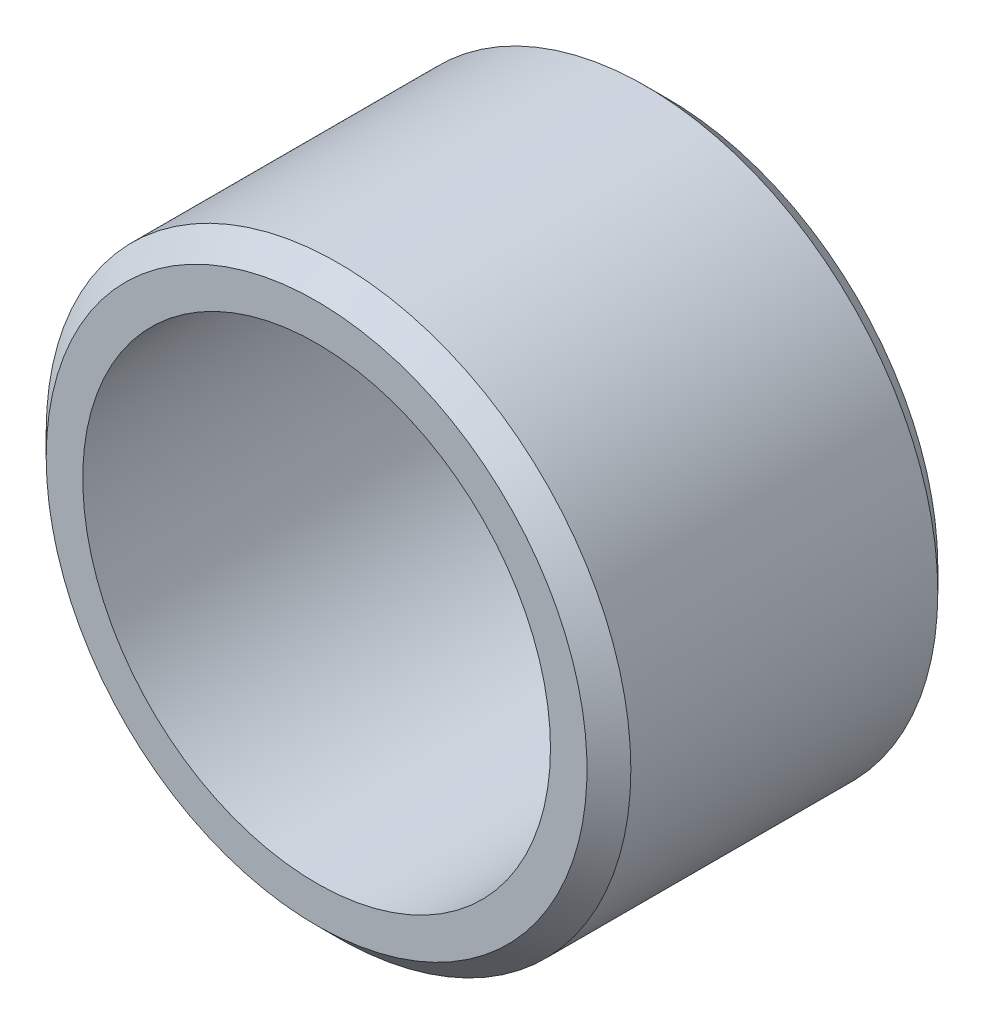
ISO-10303-21;
HEADER;
FILE_DESCRIPTION(('STEP AP214'),'2;1');
FILE_NAME('part.step','',(''),(''),'','','');
FILE_SCHEMA(('AUTOMOTIVE_DESIGN { 1 0 10303 214 1 1 1 1 }'));
ENDSEC;
DATA;
#1=APPLICATION_CONTEXT('core data for automotive mechanical design processes');
#2=APPLICATION_PROTOCOL_DEFINITION('international standard','automotive_design',2000,#1);
#3=PRODUCT_CONTEXT('',#1,'mechanical');
#4=PRODUCT('Part','Part','',(#3));
#5=PRODUCT_RELATED_PRODUCT_CATEGORY('part','',(#4));
#6=PRODUCT_DEFINITION_FORMATION('','',#4);
#7=PRODUCT_DEFINITION_CONTEXT('part definition',#1,'design');
#8=PRODUCT_DEFINITION('design','',#6,#7);
#9=PRODUCT_DEFINITION_SHAPE('','',#8);
#10=(LENGTH_UNIT() NAMED_UNIT(*) SI_UNIT(.MILLI.,.METRE.));
#11=(NAMED_UNIT(*) PLANE_ANGLE_UNIT() SI_UNIT($,.RADIAN.));
#12=(NAMED_UNIT(*) SI_UNIT($,.STERADIAN.) SOLID_ANGLE_UNIT());
#13=UNCERTAINTY_MEASURE_WITH_UNIT(LENGTH_MEASURE(1.E-05),#10,'distance_accuracy_value','');
#14=(GEOMETRIC_REPRESENTATION_CONTEXT(3) GLOBAL_UNCERTAINTY_ASSIGNED_CONTEXT((#13)) GLOBAL_UNIT_ASSIGNED_CONTEXT((#10,
#11,#12)) REPRESENTATION_CONTEXT('',''));
#15=CARTESIAN_POINT('',(0.,0.,0.));
#16=DIRECTION('',(0.,0.,1.));
#17=DIRECTION('',(1.,0.,0.));
#18=AXIS2_PLACEMENT_3D('',#15,#16,#17);
#19=CARTESIAN_POINT('',(0.,7.9375,4.7625));
#20=DIRECTION('',(0.,0.,-1.));
#21=DIRECTION('',(-1.,0.,0.));
#22=AXIS2_PLACEMENT_3D('',#19,#20,#21);
#23=PLANE('',#22);
#24=CARTESIAN_POINT('',(0.,0.,4.7625));
#25=DIRECTION('',(0.,0.,-1.));
#26=DIRECTION('',(-1.,0.,0.));
#27=AXIS2_PLACEMENT_3D('',#24,#25,#26);
#28=CIRCLE('',#27,7.3421875);
#29=CARTESIAN_POINT('',(-7.3421875,0.,4.7625));
#30=VERTEX_POINT('',#29);
#31=EDGE_CURVE('E10',#30,#30,#28,.F.);
#32=ORIENTED_EDGE('',*,*,#31,.T.);
#33=EDGE_LOOP('',(#32));
#34=FACE_BOUND('',#33,.T.);
#35=CARTESIAN_POINT('',(0.,0.,4.7625));
#36=DIRECTION('',(0.,0.,1.));
#37=DIRECTION('',(1.,0.,0.));
#38=AXIS2_PLACEMENT_3D('',#35,#36,#37);
#39=CIRCLE('',#38,6.35);
#40=CARTESIAN_POINT('',(6.35,0.,4.7625));
#41=VERTEX_POINT('',#40);
#42=EDGE_CURVE('E55',#41,#41,#39,.T.);
#43=ORIENTED_EDGE('',*,*,#42,.F.);
#44=EDGE_LOOP('',(#43));
#45=FACE_BOUND('',#44,.T.);
#46=ADVANCED_FACE('F35',(#34,#45),#23,.F.);
#47=CARTESIAN_POINT('',(0.,0.,4.7625));
#48=DIRECTION('',(0.,0.,1.));
#49=DIRECTION('',(1.,0.,0.));
#50=AXIS2_PLACEMENT_3D('',#47,#48,#49);
#51=CYLINDRICAL_SURFACE('',#50,6.35);
#52=CARTESIAN_POINT('',(0.,0.,-4.7625));
#53=DIRECTION('',(0.,0.,1.));
#54=DIRECTION('',(1.,0.,0.));
#55=AXIS2_PLACEMENT_3D('',#52,#53,#54);
#56=CIRCLE('',#55,6.35);
#57=CARTESIAN_POINT('',(6.35,0.,-4.7625));
#58=VERTEX_POINT('',#57);
#59=EDGE_CURVE('E58',#58,#58,#56,.T.);
#60=ORIENTED_EDGE('',*,*,#59,.F.);
#61=EDGE_LOOP('',(#60));
#62=FACE_BOUND('',#61,.T.);
#63=ORIENTED_EDGE('',*,*,#42,.T.);
#64=EDGE_LOOP('',(#63));
#65=FACE_BOUND('',#64,.T.);
#66=ADVANCED_FACE('F64',(#62,#65),#51,.F.);
#67=CARTESIAN_POINT('',(0.,6.35,-4.7625));
#68=DIRECTION('',(0.,0.,1.));
#69=DIRECTION('',(1.,0.,0.));
#70=AXIS2_PLACEMENT_3D('',#67,#68,#69);
#71=PLANE('',#70);
#72=CARTESIAN_POINT('',(0.,0.,-4.7625));
#73=DIRECTION('',(0.,0.,1.));
#74=DIRECTION('',(1.,0.,0.));
#75=AXIS2_PLACEMENT_3D('',#72,#73,#74);
#76=CIRCLE('',#75,7.3421875);
#77=CARTESIAN_POINT('',(7.3421875,0.,-4.7625));
#78=VERTEX_POINT('',#77);
#79=EDGE_CURVE('E42',#78,#78,#76,.F.);
#80=ORIENTED_EDGE('',*,*,#79,.T.);
#81=EDGE_LOOP('',(#80));
#82=FACE_BOUND('',#81,.T.);
#83=ORIENTED_EDGE('',*,*,#59,.T.);
#84=EDGE_LOOP('',(#83));
#85=FACE_BOUND('',#84,.T.);
#86=ADVANCED_FACE('F62',(#82,#85),#71,.F.);
#87=CARTESIAN_POINT('',(0.,0.,4.7625));
#88=DIRECTION('',(0.,0.,1.));
#89=DIRECTION('',(1.,0.,0.));
#90=AXIS2_PLACEMENT_3D('',#87,#88,#89);
#91=CYLINDRICAL_SURFACE('',#90,7.9375);
#92=CARTESIAN_POINT('',(0.,0.,-4.1671875));
#93=DIRECTION('',(0.,0.,1.));
#94=DIRECTION('',(1.,0.,0.));
#95=AXIS2_PLACEMENT_3D('',#92,#93,#94);
#96=CIRCLE('',#95,7.9375);
#97=CARTESIAN_POINT('',(7.9375,0.,-4.1671875));
#98=VERTEX_POINT('',#97);
#99=EDGE_CURVE('E46',#98,#98,#96,.T.);
#100=ORIENTED_EDGE('',*,*,#99,.T.);
#101=EDGE_LOOP('',(#100));
#102=FACE_BOUND('',#101,.T.);
#103=CARTESIAN_POINT('',(0.,0.,4.1671875));
#104=DIRECTION('',(0.,0.,-1.));
#105=DIRECTION('',(-1.,0.,0.));
#106=AXIS2_PLACEMENT_3D('',#103,#104,#105);
#107=CIRCLE('',#106,7.9375);
#108=CARTESIAN_POINT('',(-7.9375,0.,4.1671875));
#109=VERTEX_POINT('',#108);
#110=EDGE_CURVE('E50',#109,#109,#107,.T.);
#111=ORIENTED_EDGE('',*,*,#110,.T.);
#112=EDGE_LOOP('',(#111));
#113=FACE_BOUND('',#112,.T.);
#114=ADVANCED_FACE('F78',(#102,#113),#91,.T.);
#115=CARTESIAN_POINT('',(0.,0.,-4.1671875));
#116=DIRECTION('',(0.,0.,1.));
#117=DIRECTION('',(1.,0.,0.));
#118=AXIS2_PLACEMENT_3D('',#115,#116,#117);
#119=CONICAL_SURFACE('',#118,7.9375,0.785398163397451);
#120=CARTESIAN_POINT('',(7.3421875,0.,-4.7625));
#121=CARTESIAN_POINT('',(7.348388671875,0.,-4.756298828125));
#122=CARTESIAN_POINT('',(7.35458984375,0.,-4.75009765625));
#123=CARTESIAN_POINT('',(7.3669921875,0.,-4.7376953125));
#124=CARTESIAN_POINT('',(7.373193359375,0.,-4.731494140625));
#125=CARTESIAN_POINT('',(7.385595703125,0.,-4.719091796875));
#126=CARTESIAN_POINT('',(7.391796875,0.,-4.712890625));
#127=CARTESIAN_POINT('',(7.40419921875,0.,-4.70048828125));
#128=CARTESIAN_POINT('',(7.410400390625,0.,-4.694287109375));
#129=CARTESIAN_POINT('',(7.422802734375,0.,-4.681884765625));
#130=CARTESIAN_POINT('',(7.42900390625,0.,-4.67568359375));
#131=CARTESIAN_POINT('',(7.44140625,0.,-4.66328125));
#132=CARTESIAN_POINT('',(7.447607421875,0.,-4.657080078125));
#133=CARTESIAN_POINT('',(7.460009765625,0.,-4.644677734375));
#134=CARTESIAN_POINT('',(7.4662109375,0.,-4.6384765625));
#135=CARTESIAN_POINT('',(7.47861328125,0.,-4.62607421875));
#136=CARTESIAN_POINT('',(7.484814453125,0.,-4.619873046875));
#137=CARTESIAN_POINT('',(7.497216796875,0.,-4.607470703125));
#138=CARTESIAN_POINT('',(7.50341796875,0.,-4.60126953125));
#139=CARTESIAN_POINT('',(7.5158203125,0.,-4.5888671875));
#140=CARTESIAN_POINT('',(7.522021484375,0.,-4.582666015625));
#141=CARTESIAN_POINT('',(7.534423828125,0.,-4.570263671875));
#142=CARTESIAN_POINT('',(7.540625,0.,-4.5640625));
#143=CARTESIAN_POINT('',(7.55302734375,0.,-4.55166015625));
#144=CARTESIAN_POINT('',(7.559228515625,0.,-4.545458984375));
#145=CARTESIAN_POINT('',(7.571630859375,0.,-4.533056640625));
#146=CARTESIAN_POINT('',(7.57783203125,0.,-4.52685546875));
#147=CARTESIAN_POINT('',(7.590234375,0.,-4.514453125));
#148=CARTESIAN_POINT('',(7.596435546875,0.,-4.508251953125));
#149=CARTESIAN_POINT('',(7.608837890625,0.,-4.495849609375));
#150=CARTESIAN_POINT('',(7.6150390625,0.,-4.4896484375));
#151=CARTESIAN_POINT('',(7.62744140625,0.,-4.47724609375));
#152=CARTESIAN_POINT('',(7.633642578125,0.,-4.471044921875));
#153=CARTESIAN_POINT('',(7.646044921875,0.,-4.458642578125));
#154=CARTESIAN_POINT('',(7.65224609375,0.,-4.45244140625));
#155=CARTESIAN_POINT('',(7.6646484375,0.,-4.4400390625));
#156=CARTESIAN_POINT('',(7.670849609375,0.,-4.433837890625));
#157=CARTESIAN_POINT('',(7.683251953125,0.,-4.421435546875));
#158=CARTESIAN_POINT('',(7.689453125,0.,-4.415234375));
#159=CARTESIAN_POINT('',(7.70185546875,0.,-4.40283203125));
#160=CARTESIAN_POINT('',(7.708056640625,0.,-4.396630859375));
#161=CARTESIAN_POINT('',(7.720458984375,0.,-4.384228515625));
#162=CARTESIAN_POINT('',(7.72666015625,0.,-4.37802734375));
#163=CARTESIAN_POINT('',(7.7390625,0.,-4.365625));
#164=CARTESIAN_POINT('',(7.745263671875,0.,-4.359423828125));
#165=CARTESIAN_POINT('',(7.757666015625,0.,-4.347021484375));
#166=CARTESIAN_POINT('',(7.7638671875,0.,-4.3408203125));
#167=CARTESIAN_POINT('',(7.77626953125,0.,-4.32841796875));
#168=CARTESIAN_POINT('',(7.782470703125,0.,-4.322216796875));
#169=CARTESIAN_POINT('',(7.794873046875,0.,-4.309814453125));
#170=CARTESIAN_POINT('',(7.80107421875,0.,-4.30361328125));
#171=CARTESIAN_POINT('',(7.8134765625,0.,-4.2912109375));
#172=CARTESIAN_POINT('',(7.819677734375,0.,-4.285009765625));
#173=CARTESIAN_POINT('',(7.832080078125,0.,-4.272607421875));
#174=CARTESIAN_POINT('',(7.83828125,0.,-4.26640625));
#175=CARTESIAN_POINT('',(7.85068359375,0.,-4.25400390625));
#176=CARTESIAN_POINT('',(7.856884765625,0.,-4.247802734375));
#177=CARTESIAN_POINT('',(7.869287109375,0.,-4.235400390625));
#178=CARTESIAN_POINT('',(7.87548828125,0.,-4.22919921875));
#179=CARTESIAN_POINT('',(7.887890625,0.,-4.216796875));
#180=CARTESIAN_POINT('',(7.894091796875,0.,-4.210595703125));
#181=CARTESIAN_POINT('',(7.906494140625,0.,-4.198193359375));
#182=CARTESIAN_POINT('',(7.9126953125,0.,-4.1919921875));
#183=CARTESIAN_POINT('',(7.92509765625,0.,-4.17958984375));
#184=CARTESIAN_POINT('',(7.931298828125,0.,-4.173388671875));
#185=CARTESIAN_POINT('',(7.9375,0.,-4.1671875));
#186=B_SPLINE_CURVE_WITH_KNOTS('',3,(#120,#121,#122,#123,#124,#125,#126,#127,#128,#129,#130,
#131,#132,#133,#134,#135,#136,#137,#138,#139,#140,#141,#142,#143,#144,#145,#146,#147,#148,#149,
#150,#151,#152,#153,#154,#155,#156,#157,#158,#159,#160,#161,#162,#163,#164,#165,#166,#167,#168,
#169,#170,#171,#172,#173,#174,#175,#176,#177,#178,#179,#180,#181,#182,#183,#184,#185),
.UNSPECIFIED.,.F.,.F.,(4,2,2,2,2,2,2,2,2,2,2,2,2,2,2,2,2,2,2,2,2,2,2,2,2,2,2,2,2,2,2,2,4),(0.,
0.0263093441046942,0.052618688209389,0.0789280323140838,0.105237376418779,0.131546720523473,
0.157856064628168,0.184165408732863,0.210474752837558,0.236784096942252,0.263093441046947,
0.289402785151642,0.315712129256336,0.342021473361031,0.368330817465726,0.394640161570421,
0.420949505675116,0.44725884977981,0.473568193884505,0.499877537989199,0.526186882093894,
0.552496226198589,0.578805570303284,0.605114914407978,0.631424258512673,0.657733602617367,
0.684042946722062,0.710352290826757,0.736661634931452,0.762970979036147,0.789280323140841,
0.815589667245536,0.841899011350231),.UNSPECIFIED.);
#187=EDGE_CURVE('BSEAM76',#78,#98,#186,.T.);
#188=ORIENTED_EDGE('',*,*,#79,.F.);
#189=ORIENTED_EDGE('',*,*,#99,.F.);
#190=ORIENTED_EDGE('',*,*,#187,.T.);
#191=ORIENTED_EDGE('',*,*,#187,.F.);
#192=EDGE_LOOP('',(#188,#190,#189,#191));
#193=FACE_BOUND('',#192,.T.);
#194=ADVANCED_FACE('F76',(#193),#119,.T.);
#195=CARTESIAN_POINT('',(0.,0.,4.7625));
#196=DIRECTION('',(0.,0.,-1.));
#197=DIRECTION('',(-1.,0.,0.));
#198=AXIS2_PLACEMENT_3D('',#195,#196,#197);
#199=CONICAL_SURFACE('',#198,7.3421875,0.785398163397445);
#200=ORIENTED_EDGE('',*,*,#110,.F.);
#201=EDGE_LOOP('',(#200));
#202=FACE_BOUND('',#201,.T.);
#203=ORIENTED_EDGE('',*,*,#31,.F.);
#204=EDGE_LOOP('',(#203));
#205=FACE_BOUND('',#204,.T.);
#206=ADVANCED_FACE('F37',(#202,#205),#199,.T.);
#207=CLOSED_SHELL('',(#46,#66,#86,#114,#194,#206));
#208=MANIFOLD_SOLID_BREP('B2',#207);
#209=ADVANCED_BREP_SHAPE_REPRESENTATION('',(#18,#208),#14);
#210=SHAPE_DEFINITION_REPRESENTATION(#9,#209);
ENDSEC;
END-ISO-10303-21;
